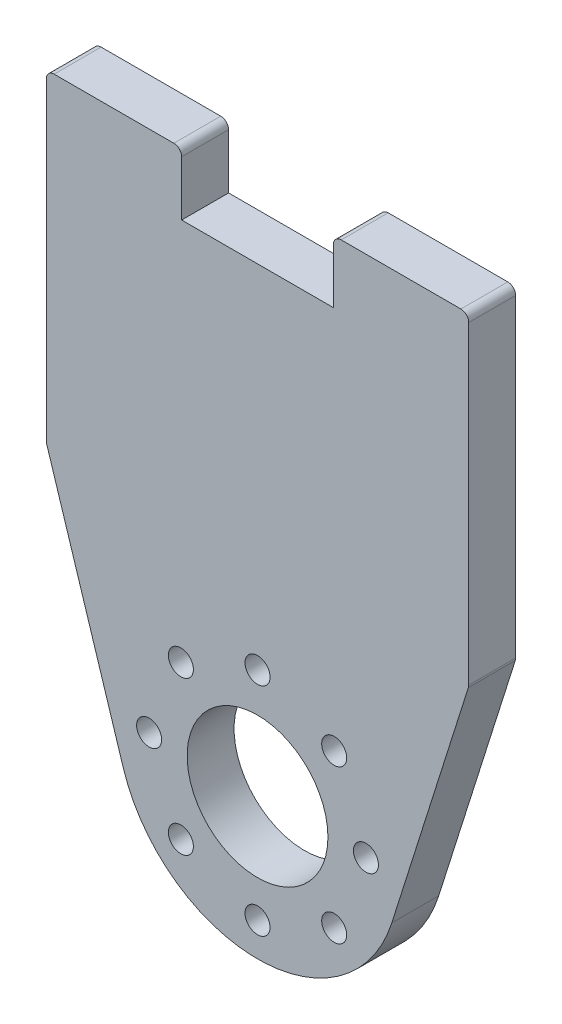
ISO-10303-21;
HEADER;
FILE_DESCRIPTION(('STEP AP214'),'2;1');
FILE_NAME('part.step','',(''),(''),'','','');
FILE_SCHEMA(('AUTOMOTIVE_DESIGN { 1 0 10303 214 1 1 1 1 }'));
ENDSEC;
DATA;
#1=APPLICATION_CONTEXT('core data for automotive mechanical design processes');
#2=APPLICATION_PROTOCOL_DEFINITION('international standard','automotive_design',2000,#1);
#3=PRODUCT_CONTEXT('',#1,'mechanical');
#4=PRODUCT('Part','Part','',(#3));
#5=PRODUCT_RELATED_PRODUCT_CATEGORY('part','',(#4));
#6=PRODUCT_DEFINITION_FORMATION('','',#4);
#7=PRODUCT_DEFINITION_CONTEXT('part definition',#1,'design');
#8=PRODUCT_DEFINITION('design','',#6,#7);
#9=PRODUCT_DEFINITION_SHAPE('','',#8);
#10=(LENGTH_UNIT() NAMED_UNIT(*) SI_UNIT(.MILLI.,.METRE.));
#11=(NAMED_UNIT(*) PLANE_ANGLE_UNIT() SI_UNIT($,.RADIAN.));
#12=(NAMED_UNIT(*) SI_UNIT($,.STERADIAN.) SOLID_ANGLE_UNIT());
#13=UNCERTAINTY_MEASURE_WITH_UNIT(LENGTH_MEASURE(1.E-05),#10,'distance_accuracy_value','');
#14=(GEOMETRIC_REPRESENTATION_CONTEXT(3) GLOBAL_UNCERTAINTY_ASSIGNED_CONTEXT((#13)) GLOBAL_UNIT_ASSIGNED_CONTEXT((#10,
#11,#12)) REPRESENTATION_CONTEXT('',''));
#15=CARTESIAN_POINT('',(0.,0.,0.));
#16=DIRECTION('',(0.,0.,1.));
#17=DIRECTION('',(1.,0.,0.));
#18=AXIS2_PLACEMENT_3D('',#15,#16,#17);
#19=CARTESIAN_POINT('',(0.,-29.4808369003028,3.));
#20=DIRECTION('',(0.,0.,-1.));
#21=DIRECTION('',(-1.,0.,0.));
#22=AXIS2_PLACEMENT_3D('',#19,#20,#21);
#23=CYLINDRICAL_SURFACE('',#22,9.);
#24=CARTESIAN_POINT('',(0.,-29.4808369003028,0.));
#25=DIRECTION('',(0.,0.,1.));
#26=DIRECTION('',(1.,0.,0.));
#27=AXIS2_PLACEMENT_3D('',#24,#25,#26);
#28=CIRCLE('',#27,9.);
#29=CARTESIAN_POINT('',(-8.5809139759614,-32.1952273175329,0.));
#30=VERTEX_POINT('',#29);
#31=CARTESIAN_POINT('',(8.5809139759614,-32.1952273175329,0.));
#32=VERTEX_POINT('',#31);
#33=EDGE_CURVE('E170',#30,#32,#28,.T.);
#34=ORIENTED_EDGE('',*,*,#33,.T.);
#35=DIRECTION('',(0.,0.,-1.));
#36=VECTOR('',#35,1.);
#37=CARTESIAN_POINT('',(8.5809139759614,-32.1952273175329,3.));
#38=LINE('',#37,#36);
#39=CARTESIAN_POINT('',(8.5809139759614,-32.1952273175329,3.));
#40=VERTEX_POINT('',#39);
#41=EDGE_CURVE('E152',#40,#32,#38,.T.);
#42=ORIENTED_EDGE('',*,*,#41,.F.);
#43=CARTESIAN_POINT('',(0.,-29.4808369003028,3.));
#44=DIRECTION('',(0.,0.,1.));
#45=DIRECTION('',(1.,0.,0.));
#46=AXIS2_PLACEMENT_3D('',#43,#44,#45);
#47=CIRCLE('',#46,9.);
#48=CARTESIAN_POINT('',(-8.5809139759614,-32.1952273175329,3.));
#49=VERTEX_POINT('',#48);
#50=EDGE_CURVE('E158',#49,#40,#47,.T.);
#51=ORIENTED_EDGE('',*,*,#50,.F.);
#52=DIRECTION('',(0.,0.,-1.));
#53=VECTOR('',#52,1.);
#54=CARTESIAN_POINT('',(-8.5809139759614,-32.1952273175329,3.));
#55=LINE('',#54,#53);
#56=EDGE_CURVE('E270',#49,#30,#55,.T.);
#57=ORIENTED_EDGE('',*,*,#56,.T.);
#58=EDGE_LOOP('',(#34,#42,#51,#57));
#59=FACE_BOUND('',#58,.T.);
#60=ADVANCED_FACE('F33',(#59),#23,.T.);
#61=CARTESIAN_POINT('',(17.0582744539399,-5.39602387833832,3.));
#62=DIRECTION('',(0.953434886217933,-0.301598935247784,0.));
#63=DIRECTION('',(0.301598935247784,0.953434886217933,0.));
#64=AXIS2_PLACEMENT_3D('',#61,#62,#63);
#65=PLANE('',#64);
#66=DIRECTION('',(-0.301598935247784,-0.953434886217933,0.));
#67=VECTOR('',#66,1.);
#68=CARTESIAN_POINT('',(17.0582744539399,-5.39602387833832,0.));
#69=LINE('',#68,#67);
#70=CARTESIAN_POINT('',(13.476717443109,-16.7182833495104,0.));
#71=VERTEX_POINT('',#70);
#72=EDGE_CURVE('E298',#71,#32,#69,.T.);
#73=ORIENTED_EDGE('',*,*,#72,.F.);
#74=DIRECTION('',(0.,0.,-1.));
#75=VECTOR('',#74,1.);
#76=CARTESIAN_POINT('',(13.476717443109,-16.7182833495104,3.));
#77=LINE('',#76,#75);
#78=CARTESIAN_POINT('',(13.476717443109,-16.7182833495104,3.));
#79=VERTEX_POINT('',#78);
#80=EDGE_CURVE('E155',#71,#79,#77,.F.);
#81=ORIENTED_EDGE('',*,*,#80,.T.);
#82=DIRECTION('',(-0.301598935247784,-0.953434886217933,0.));
#83=VECTOR('',#82,1.);
#84=CARTESIAN_POINT('',(17.0582744539399,-5.39602387833832,3.));
#85=LINE('',#84,#83);
#86=EDGE_CURVE('E147',#79,#40,#85,.T.);
#87=ORIENTED_EDGE('',*,*,#86,.T.);
#88=ORIENTED_EDGE('',*,*,#41,.T.);
#89=EDGE_LOOP('',(#73,#81,#87,#88));
#90=FACE_BOUND('',#89,.T.);
#91=ADVANCED_FACE('F150',(#90),#65,.T.);
#92=CARTESIAN_POINT('',(13.5,0.,3.));
#93=DIRECTION('',(1.,0.,0.));
#94=DIRECTION('',(0.,0.,-1.));
#95=AXIS2_PLACEMENT_3D('',#92,#93,#94);
#96=PLANE('',#95);
#97=DIRECTION('',(0.,-1.,0.));
#98=VECTOR('',#97,1.);
#99=CARTESIAN_POINT('',(13.5,0.,3.));
#100=LINE('',#99,#98);
#101=CARTESIAN_POINT('',(13.5,3.5,3.));
#102=VERTEX_POINT('',#101);
#103=CARTESIAN_POINT('',(13.5,-16.5674838818865,3.));
#104=VERTEX_POINT('',#103);
#105=EDGE_CURVE('E157',#102,#104,#100,.T.);
#106=ORIENTED_EDGE('',*,*,#105,.T.);
#107=DIRECTION('',(0.,0.,-1.));
#108=VECTOR('',#107,1.);
#109=CARTESIAN_POINT('',(13.5,-16.5674838818865,3.));
#110=LINE('',#109,#108);
#111=CARTESIAN_POINT('',(13.5,-16.5674838818865,0.));
#112=VERTEX_POINT('',#111);
#113=EDGE_CURVE('E174',#104,#112,#110,.T.);
#114=ORIENTED_EDGE('',*,*,#113,.T.);
#115=DIRECTION('',(0.,-1.,0.));
#116=VECTOR('',#115,1.);
#117=CARTESIAN_POINT('',(13.5,0.,0.));
#118=LINE('',#117,#116);
#119=CARTESIAN_POINT('',(13.5,3.5,0.));
#120=VERTEX_POINT('',#119);
#121=EDGE_CURVE('E296',#120,#112,#118,.T.);
#122=ORIENTED_EDGE('',*,*,#121,.F.);
#123=DIRECTION('',(0.,0.,-1.));
#124=VECTOR('',#123,1.);
#125=CARTESIAN_POINT('',(13.5,3.5,3.));
#126=LINE('',#125,#124);
#127=EDGE_CURVE('E171',#120,#102,#126,.F.);
#128=ORIENTED_EDGE('',*,*,#127,.T.);
#129=EDGE_LOOP('',(#106,#114,#122,#128));
#130=FACE_BOUND('',#129,.T.);
#131=ADVANCED_FACE('F366',(#130),#96,.T.);
#132=CARTESIAN_POINT('',(0.,4.,3.));
#133=DIRECTION('',(0.,1.,0.));
#134=DIRECTION('',(0.,0.,1.));
#135=AXIS2_PLACEMENT_3D('',#132,#133,#134);
#136=PLANE('',#135);
#137=DIRECTION('',(1.,0.,0.));
#138=VECTOR('',#137,1.);
#139=CARTESIAN_POINT('',(0.,4.,3.));
#140=LINE('',#139,#138);
#141=CARTESIAN_POINT('',(5.35,4.,3.));
#142=VERTEX_POINT('',#141);
#143=CARTESIAN_POINT('',(13.,4.,3.));
#144=VERTEX_POINT('',#143);
#145=EDGE_CURVE('E338',#142,#144,#140,.T.);
#146=ORIENTED_EDGE('',*,*,#145,.T.);
#147=DIRECTION('',(0.,0.,-1.));
#148=VECTOR('',#147,1.);
#149=CARTESIAN_POINT('',(13.,4.,3.));
#150=LINE('',#149,#148);
#151=CARTESIAN_POINT('',(13.,4.,0.));
#152=VERTEX_POINT('',#151);
#153=EDGE_CURVE('E207',#144,#152,#150,.T.);
#154=ORIENTED_EDGE('',*,*,#153,.T.);
#155=DIRECTION('',(1.,0.,0.));
#156=VECTOR('',#155,1.);
#157=CARTESIAN_POINT('',(0.,4.,0.));
#158=LINE('',#157,#156);
#159=CARTESIAN_POINT('',(5.35,4.,0.));
#160=VERTEX_POINT('',#159);
#161=EDGE_CURVE('E291',#160,#152,#158,.T.);
#162=ORIENTED_EDGE('',*,*,#161,.F.);
#163=DIRECTION('',(0.,0.,-1.));
#164=VECTOR('',#163,1.);
#165=CARTESIAN_POINT('',(5.35,4.,3.));
#166=LINE('',#165,#164);
#167=EDGE_CURVE('E205',#160,#142,#166,.F.);
#168=ORIENTED_EDGE('',*,*,#167,.T.);
#169=EDGE_LOOP('',(#146,#154,#162,#168));
#170=FACE_BOUND('',#169,.T.);
#171=ADVANCED_FACE('F407',(#170),#136,.T.);
#172=CARTESIAN_POINT('',(4.85,0.,3.));
#173=DIRECTION('',(-1.,0.,0.));
#174=DIRECTION('',(0.,-1.,0.));
#175=AXIS2_PLACEMENT_3D('',#172,#173,#174);
#176=PLANE('',#175);
#177=DIRECTION('',(0.,1.,0.));
#178=VECTOR('',#177,1.);
#179=CARTESIAN_POINT('',(4.85,0.,3.));
#180=LINE('',#179,#178);
#181=CARTESIAN_POINT('',(4.85,0.,3.));
#182=VERTEX_POINT('',#181);
#183=CARTESIAN_POINT('',(4.85,3.5,3.));
#184=VERTEX_POINT('',#183);
#185=EDGE_CURVE('E335',#182,#184,#180,.T.);
#186=ORIENTED_EDGE('',*,*,#185,.T.);
#187=DIRECTION('',(0.,0.,-1.));
#188=VECTOR('',#187,1.);
#189=CARTESIAN_POINT('',(4.85,3.5,3.));
#190=LINE('',#189,#188);
#191=CARTESIAN_POINT('',(4.85,3.5,0.));
#192=VERTEX_POINT('',#191);
#193=EDGE_CURVE('E210',#184,#192,#190,.T.);
#194=ORIENTED_EDGE('',*,*,#193,.T.);
#195=DIRECTION('',(0.,1.,0.));
#196=VECTOR('',#195,1.);
#197=CARTESIAN_POINT('',(4.85,0.,0.));
#198=LINE('',#197,#196);
#199=CARTESIAN_POINT('',(4.85,0.,0.));
#200=VERTEX_POINT('',#199);
#201=EDGE_CURVE('E289',#200,#192,#198,.T.);
#202=ORIENTED_EDGE('',*,*,#201,.F.);
#203=DIRECTION('',(0.,0.,-1.));
#204=VECTOR('',#203,1.);
#205=CARTESIAN_POINT('',(4.85,0.,3.));
#206=LINE('',#205,#204);
#207=EDGE_CURVE('E172',#182,#200,#206,.T.);
#208=ORIENTED_EDGE('',*,*,#207,.F.);
#209=EDGE_LOOP('',(#186,#194,#202,#208));
#210=FACE_BOUND('',#209,.T.);
#211=ADVANCED_FACE('F403',(#210),#176,.T.);
#212=CARTESIAN_POINT('',(0.,0.,3.));
#213=DIRECTION('',(0.,1.,0.));
#214=DIRECTION('',(-1.,0.,0.));
#215=AXIS2_PLACEMENT_3D('',#212,#213,#214);
#216=PLANE('',#215);
#217=DIRECTION('',(1.,0.,0.));
#218=VECTOR('',#217,1.);
#219=CARTESIAN_POINT('',(0.,0.,0.));
#220=LINE('',#219,#218);
#221=CARTESIAN_POINT('',(-4.85,0.,0.));
#222=VERTEX_POINT('',#221);
#223=EDGE_CURVE('E285',#222,#200,#220,.T.);
#224=ORIENTED_EDGE('',*,*,#223,.F.);
#225=DIRECTION('',(0.,0.,-1.));
#226=VECTOR('',#225,1.);
#227=CARTESIAN_POINT('',(-4.85,0.,3.));
#228=LINE('',#227,#226);
#229=CARTESIAN_POINT('',(-4.85,0.,3.));
#230=VERTEX_POINT('',#229);
#231=EDGE_CURVE('E176',#230,#222,#228,.T.);
#232=ORIENTED_EDGE('',*,*,#231,.F.);
#233=DIRECTION('',(1.,0.,0.));
#234=VECTOR('',#233,1.);
#235=CARTESIAN_POINT('',(0.,0.,3.));
#236=LINE('',#235,#234);
#237=EDGE_CURVE('E333',#230,#182,#236,.T.);
#238=ORIENTED_EDGE('',*,*,#237,.T.);
#239=ORIENTED_EDGE('',*,*,#207,.T.);
#240=EDGE_LOOP('',(#224,#232,#238,#239));
#241=FACE_BOUND('',#240,.T.);
#242=ADVANCED_FACE('F286',(#241),#216,.T.);
#243=CARTESIAN_POINT('',(-4.85,0.,3.));
#244=DIRECTION('',(1.,0.,0.));
#245=DIRECTION('',(0.,0.,-1.));
#246=AXIS2_PLACEMENT_3D('',#243,#244,#245);
#247=PLANE('',#246);
#248=DIRECTION('',(0.,-1.,0.));
#249=VECTOR('',#248,1.);
#250=CARTESIAN_POINT('',(-4.85,0.,0.));
#251=LINE('',#250,#249);
#252=CARTESIAN_POINT('',(-4.85,3.5,0.));
#253=VERTEX_POINT('',#252);
#254=EDGE_CURVE('E243',#253,#222,#251,.T.);
#255=ORIENTED_EDGE('',*,*,#254,.F.);
#256=DIRECTION('',(0.,0.,-1.));
#257=VECTOR('',#256,1.);
#258=CARTESIAN_POINT('',(-4.85,3.5,3.));
#259=LINE('',#258,#257);
#260=CARTESIAN_POINT('',(-4.85,3.5,3.));
#261=VERTEX_POINT('',#260);
#262=EDGE_CURVE('E218',#253,#261,#259,.F.);
#263=ORIENTED_EDGE('',*,*,#262,.T.);
#264=DIRECTION('',(0.,-1.,0.));
#265=VECTOR('',#264,1.);
#266=CARTESIAN_POINT('',(-4.85,0.,3.));
#267=LINE('',#266,#265);
#268=EDGE_CURVE('E280',#261,#230,#267,.T.);
#269=ORIENTED_EDGE('',*,*,#268,.T.);
#270=ORIENTED_EDGE('',*,*,#231,.T.);
#271=EDGE_LOOP('',(#255,#263,#269,#270));
#272=FACE_BOUND('',#271,.T.);
#273=ADVANCED_FACE('F277',(#272),#247,.T.);
#274=CARTESIAN_POINT('',(0.,4.,3.));
#275=DIRECTION('',(0.,1.,0.));
#276=DIRECTION('',(0.,0.,1.));
#277=AXIS2_PLACEMENT_3D('',#274,#275,#276);
#278=PLANE('',#277);
#279=DIRECTION('',(1.,0.,0.));
#280=VECTOR('',#279,1.);
#281=CARTESIAN_POINT('',(0.,4.,3.));
#282=LINE('',#281,#280);
#283=CARTESIAN_POINT('',(-13.,4.,3.));
#284=VERTEX_POINT('',#283);
#285=CARTESIAN_POINT('',(-5.35,4.,3.));
#286=VERTEX_POINT('',#285);
#287=EDGE_CURVE('E329',#284,#286,#282,.T.);
#288=ORIENTED_EDGE('',*,*,#287,.T.);
#289=DIRECTION('',(0.,0.,-1.));
#290=VECTOR('',#289,1.);
#291=CARTESIAN_POINT('',(-5.35,4.,3.));
#292=LINE('',#291,#290);
#293=CARTESIAN_POINT('',(-5.35,4.,0.));
#294=VERTEX_POINT('',#293);
#295=EDGE_CURVE('E215',#286,#294,#292,.T.);
#296=ORIENTED_EDGE('',*,*,#295,.T.);
#297=DIRECTION('',(1.,0.,0.));
#298=VECTOR('',#297,1.);
#299=CARTESIAN_POINT('',(0.,4.,0.));
#300=LINE('',#299,#298);
#301=CARTESIAN_POINT('',(-13.,4.,0.));
#302=VERTEX_POINT('',#301);
#303=EDGE_CURVE('E239',#302,#294,#300,.T.);
#304=ORIENTED_EDGE('',*,*,#303,.F.);
#305=DIRECTION('',(0.,0.,-1.));
#306=VECTOR('',#305,1.);
#307=CARTESIAN_POINT('',(-13.,4.,3.));
#308=LINE('',#307,#306);
#309=EDGE_CURVE('E213',#302,#284,#308,.F.);
#310=ORIENTED_EDGE('',*,*,#309,.T.);
#311=EDGE_LOOP('',(#288,#296,#304,#310));
#312=FACE_BOUND('',#311,.T.);
#313=ADVANCED_FACE('F395',(#312),#278,.T.);
#314=CARTESIAN_POINT('',(-13.5,0.,3.));
#315=DIRECTION('',(-1.,0.,0.));
#316=DIRECTION('',(0.,0.,1.));
#317=AXIS2_PLACEMENT_3D('',#314,#315,#316);
#318=PLANE('',#317);
#319=DIRECTION('',(0.,1.,0.));
#320=VECTOR('',#319,1.);
#321=CARTESIAN_POINT('',(-13.5,0.,3.));
#322=LINE('',#321,#320);
#323=CARTESIAN_POINT('',(-13.5,-16.5674838818865,3.));
#324=VERTEX_POINT('',#323);
#325=CARTESIAN_POINT('',(-13.5,3.5,3.));
#326=VERTEX_POINT('',#325);
#327=EDGE_CURVE('E229',#324,#326,#322,.T.);
#328=ORIENTED_EDGE('',*,*,#327,.T.);
#329=DIRECTION('',(0.,0.,-1.));
#330=VECTOR('',#329,1.);
#331=CARTESIAN_POINT('',(-13.5,3.5,3.));
#332=LINE('',#331,#330);
#333=CARTESIAN_POINT('',(-13.5,3.5,0.));
#334=VERTEX_POINT('',#333);
#335=EDGE_CURVE('E41',#326,#334,#332,.T.);
#336=ORIENTED_EDGE('',*,*,#335,.T.);
#337=DIRECTION('',(0.,1.,0.));
#338=VECTOR('',#337,1.);
#339=CARTESIAN_POINT('',(-13.5,0.,0.));
#340=LINE('',#339,#338);
#341=CARTESIAN_POINT('',(-13.5,-16.5674838818865,0.));
#342=VERTEX_POINT('',#341);
#343=EDGE_CURVE('E227',#342,#334,#340,.T.);
#344=ORIENTED_EDGE('',*,*,#343,.F.);
#345=DIRECTION('',(0.,0.,-1.));
#346=VECTOR('',#345,1.);
#347=CARTESIAN_POINT('',(-13.5,-16.5674838818865,3.));
#348=LINE('',#347,#346);
#349=EDGE_CURVE('E220',#342,#324,#348,.F.);
#350=ORIENTED_EDGE('',*,*,#349,.T.);
#351=EDGE_LOOP('',(#328,#336,#344,#350));
#352=FACE_BOUND('',#351,.T.);
#353=ADVANCED_FACE('F226',(#352),#318,.T.);
#354=CARTESIAN_POINT('',(6.92938229027665,-29.4102191905791,3.));
#355=DIRECTION('',(0.,0.,-1.));
#356=DIRECTION('',(-1.,0.,0.));
#357=AXIS2_PLACEMENT_3D('',#354,#355,#356);
#358=CYLINDRICAL_SURFACE('',#357,0.799999999999997);
#359=CARTESIAN_POINT('',(6.92938229027665,-29.4102191905791,3.));
#360=DIRECTION('',(0.,0.,1.));
#361=DIRECTION('',(1.,0.,0.));
#362=AXIS2_PLACEMENT_3D('',#359,#360,#361);
#363=CIRCLE('',#362,0.799999999999997);
#364=CARTESIAN_POINT('',(7.72938229027665,-29.4102191905791,3.));
#365=VERTEX_POINT('',#364);
#366=EDGE_CURVE('E306',#365,#365,#363,.T.);
#367=ORIENTED_EDGE('',*,*,#366,.T.);
#368=EDGE_LOOP('',(#367));
#369=FACE_BOUND('',#368,.T.);
#370=CARTESIAN_POINT('',(6.92938229027665,-29.4102191905791,0.));
#371=DIRECTION('',(0.,0.,1.));
#372=DIRECTION('',(1.,0.,0.));
#373=AXIS2_PLACEMENT_3D('',#370,#371,#372);
#374=CIRCLE('',#373,0.799999999999997);
#375=CARTESIAN_POINT('',(7.72938229027665,-29.4102191905791,0.));
#376=VERTEX_POINT('',#375);
#377=EDGE_CURVE('E264',#376,#376,#374,.T.);
#378=ORIENTED_EDGE('',*,*,#377,.F.);
#379=EDGE_LOOP('',(#378));
#380=FACE_BOUND('',#379,.T.);
#381=ADVANCED_FACE('F430',(#369,#380),#358,.F.);
#382=CARTESIAN_POINT('',(4.89981320688851,-24.5104059836907,3.));
#383=DIRECTION('',(0.,0.,-1.));
#384=DIRECTION('',(-1.,0.,0.));
#385=AXIS2_PLACEMENT_3D('',#382,#383,#384);
#386=CYLINDRICAL_SURFACE('',#385,0.799999999999999);
#387=CARTESIAN_POINT('',(4.89981320688851,-24.5104059836907,3.));
#388=DIRECTION('',(0.,0.,1.));
#389=DIRECTION('',(1.,0.,0.));
#390=AXIS2_PLACEMENT_3D('',#387,#388,#389);
#391=CIRCLE('',#390,0.799999999999999);
#392=CARTESIAN_POINT('',(5.69981320688851,-24.5104059836907,3.));
#393=VERTEX_POINT('',#392);
#394=EDGE_CURVE('E309',#393,#393,#391,.T.);
#395=ORIENTED_EDGE('',*,*,#394,.T.);
#396=EDGE_LOOP('',(#395));
#397=FACE_BOUND('',#396,.T.);
#398=CARTESIAN_POINT('',(4.89981320688851,-24.5104059836907,0.));
#399=DIRECTION('',(0.,0.,1.));
#400=DIRECTION('',(1.,0.,0.));
#401=AXIS2_PLACEMENT_3D('',#398,#399,#400);
#402=CIRCLE('',#401,0.799999999999999);
#403=CARTESIAN_POINT('',(5.69981320688851,-24.5104059836907,0.));
#404=VERTEX_POINT('',#403);
#405=EDGE_CURVE('E261',#404,#404,#402,.T.);
#406=ORIENTED_EDGE('',*,*,#405,.F.);
#407=EDGE_LOOP('',(#406));
#408=FACE_BOUND('',#407,.T.);
#409=ADVANCED_FACE('F475',(#397,#408),#386,.F.);
#410=CARTESIAN_POINT('',(-4.89981320688812,-34.3100323974679,3.));
#411=DIRECTION('',(0.,0.,-1.));
#412=DIRECTION('',(-1.,0.,0.));
#413=AXIS2_PLACEMENT_3D('',#410,#411,#412);
#414=CYLINDRICAL_SURFACE('',#413,0.800000000000005);
#415=CARTESIAN_POINT('',(-4.89981320688812,-34.3100323974679,3.));
#416=DIRECTION('',(0.,0.,1.));
#417=DIRECTION('',(1.,0.,0.));
#418=AXIS2_PLACEMENT_3D('',#415,#416,#417);
#419=CIRCLE('',#418,0.800000000000005);
#420=CARTESIAN_POINT('',(-4.09981320688812,-34.3100323974679,3.));
#421=VERTEX_POINT('',#420);
#422=EDGE_CURVE('E312',#421,#421,#419,.T.);
#423=ORIENTED_EDGE('',*,*,#422,.T.);
#424=EDGE_LOOP('',(#423));
#425=FACE_BOUND('',#424,.T.);
#426=CARTESIAN_POINT('',(-4.89981320688812,-34.3100323974679,0.));
#427=DIRECTION('',(0.,0.,1.));
#428=DIRECTION('',(1.,0.,0.));
#429=AXIS2_PLACEMENT_3D('',#426,#427,#428);
#430=CIRCLE('',#429,0.800000000000005);
#431=CARTESIAN_POINT('',(-4.09981320688812,-34.3100323974679,0.));
#432=VERTEX_POINT('',#431);
#433=EDGE_CURVE('E258',#432,#432,#430,.T.);
#434=ORIENTED_EDGE('',*,*,#433,.F.);
#435=EDGE_LOOP('',(#434));
#436=FACE_BOUND('',#435,.T.);
#437=ADVANCED_FACE('F483',(#425,#436),#414,.F.);
#438=CARTESIAN_POINT('',(-6.92938229027627,-29.4102191905795,3.));
#439=DIRECTION('',(0.,0.,-1.));
#440=DIRECTION('',(-1.,0.,0.));
#441=AXIS2_PLACEMENT_3D('',#438,#439,#440);
#442=CYLINDRICAL_SURFACE('',#441,0.8);
#443=CARTESIAN_POINT('',(-6.92938229027627,-29.4102191905795,3.));
#444=DIRECTION('',(0.,0.,1.));
#445=DIRECTION('',(1.,0.,0.));
#446=AXIS2_PLACEMENT_3D('',#443,#444,#445);
#447=CIRCLE('',#446,0.8);
#448=CARTESIAN_POINT('',(-6.12938229027627,-29.4102191905795,3.));
#449=VERTEX_POINT('',#448);
#450=EDGE_CURVE('E315',#449,#449,#447,.T.);
#451=ORIENTED_EDGE('',*,*,#450,.T.);
#452=EDGE_LOOP('',(#451));
#453=FACE_BOUND('',#452,.T.);
#454=CARTESIAN_POINT('',(-6.92938229027627,-29.4102191905795,0.));
#455=DIRECTION('',(0.,0.,1.));
#456=DIRECTION('',(1.,0.,0.));
#457=AXIS2_PLACEMENT_3D('',#454,#455,#456);
#458=CIRCLE('',#457,0.8);
#459=CARTESIAN_POINT('',(-6.12938229027627,-29.4102191905795,0.));
#460=VERTEX_POINT('',#459);
#461=EDGE_CURVE('E255',#460,#460,#458,.T.);
#462=ORIENTED_EDGE('',*,*,#461,.F.);
#463=EDGE_LOOP('',(#462));
#464=FACE_BOUND('',#463,.T.);
#465=ADVANCED_FACE('F491',(#453,#464),#442,.F.);
#466=CARTESIAN_POINT('',(-4.8998132068884,-24.510405983691,3.));
#467=DIRECTION('',(0.,0.,-1.));
#468=DIRECTION('',(-1.,0.,0.));
#469=AXIS2_PLACEMENT_3D('',#466,#467,#468);
#470=CYLINDRICAL_SURFACE('',#469,0.799999999999997);
#471=CARTESIAN_POINT('',(-4.8998132068884,-24.510405983691,3.));
#472=DIRECTION('',(0.,0.,1.));
#473=DIRECTION('',(1.,0.,0.));
#474=AXIS2_PLACEMENT_3D('',#471,#472,#473);
#475=CIRCLE('',#474,0.799999999999997);
#476=CARTESIAN_POINT('',(-4.0998132068884,-24.510405983691,3.));
#477=VERTEX_POINT('',#476);
#478=EDGE_CURVE('E318',#477,#477,#475,.T.);
#479=ORIENTED_EDGE('',*,*,#478,.T.);
#480=EDGE_LOOP('',(#479));
#481=FACE_BOUND('',#480,.T.);
#482=CARTESIAN_POINT('',(-4.8998132068884,-24.510405983691,0.));
#483=DIRECTION('',(0.,0.,1.));
#484=DIRECTION('',(1.,0.,0.));
#485=AXIS2_PLACEMENT_3D('',#482,#483,#484);
#486=CIRCLE('',#485,0.799999999999997);
#487=CARTESIAN_POINT('',(-4.0998132068884,-24.510405983691,0.));
#488=VERTEX_POINT('',#487);
#489=EDGE_CURVE('E252',#488,#488,#486,.T.);
#490=ORIENTED_EDGE('',*,*,#489,.F.);
#491=EDGE_LOOP('',(#490));
#492=FACE_BOUND('',#491,.T.);
#493=ADVANCED_FACE('F499',(#481,#492),#470,.F.);
#494=CARTESIAN_POINT('',(0.,-29.4808369003028,3.));
#495=DIRECTION('',(0.,0.,-1.));
#496=DIRECTION('',(-1.,0.,0.));
#497=AXIS2_PLACEMENT_3D('',#494,#495,#496);
#498=CYLINDRICAL_SURFACE('',#497,4.5);
#499=CARTESIAN_POINT('',(0.,-29.4808369003028,3.));
#500=DIRECTION('',(0.,0.,1.));
#501=DIRECTION('',(1.,0.,0.));
#502=AXIS2_PLACEMENT_3D('',#499,#500,#501);
#503=CIRCLE('',#502,4.5);
#504=CARTESIAN_POINT('',(4.5,-29.4808369003028,3.));
#505=VERTEX_POINT('',#504);
#506=EDGE_CURVE('E321',#505,#505,#503,.T.);
#507=ORIENTED_EDGE('',*,*,#506,.T.);
#508=EDGE_LOOP('',(#507));
#509=FACE_BOUND('',#508,.T.);
#510=CARTESIAN_POINT('',(0.,-29.4808369003028,0.));
#511=DIRECTION('',(0.,0.,1.));
#512=DIRECTION('',(1.,0.,0.));
#513=AXIS2_PLACEMENT_3D('',#510,#511,#512);
#514=CIRCLE('',#513,4.5);
#515=CARTESIAN_POINT('',(4.5,-29.4808369003028,0.));
#516=VERTEX_POINT('',#515);
#517=EDGE_CURVE('E249',#516,#516,#514,.T.);
#518=ORIENTED_EDGE('',*,*,#517,.F.);
#519=EDGE_LOOP('',(#518));
#520=FACE_BOUND('',#519,.T.);
#521=ADVANCED_FACE('F423',(#509,#520),#498,.F.);
#522=CARTESIAN_POINT('',(3.9058927972018E-13,-36.3396014808557,3.));
#523=DIRECTION('',(0.,0.,-1.));
#524=DIRECTION('',(-1.,0.,0.));
#525=AXIS2_PLACEMENT_3D('',#522,#523,#524);
#526=CYLINDRICAL_SURFACE('',#525,0.800000000000006);
#527=CARTESIAN_POINT('',(3.9058927972018E-13,-36.3396014808557,3.));
#528=DIRECTION('',(0.,0.,1.));
#529=DIRECTION('',(1.,0.,0.));
#530=AXIS2_PLACEMENT_3D('',#527,#528,#529);
#531=CIRCLE('',#530,0.800000000000006);
#532=CARTESIAN_POINT('',(0.800000000000396,-36.3396014808557,3.));
#533=VERTEX_POINT('',#532);
#534=EDGE_CURVE('E324',#533,#533,#531,.T.);
#535=ORIENTED_EDGE('',*,*,#534,.T.);
#536=EDGE_LOOP('',(#535));
#537=FACE_BOUND('',#536,.T.);
#538=CARTESIAN_POINT('',(3.9058927972018E-13,-36.3396014808557,0.));
#539=DIRECTION('',(0.,0.,1.));
#540=DIRECTION('',(1.,0.,0.));
#541=AXIS2_PLACEMENT_3D('',#538,#539,#540);
#542=CIRCLE('',#541,0.800000000000006);
#543=CARTESIAN_POINT('',(0.800000000000396,-36.3396014808557,0.));
#544=VERTEX_POINT('',#543);
#545=EDGE_CURVE('E241',#544,#544,#542,.T.);
#546=ORIENTED_EDGE('',*,*,#545,.F.);
#547=EDGE_LOOP('',(#546));
#548=FACE_BOUND('',#547,.T.);
#549=ADVANCED_FACE('F418',(#537,#548),#526,.F.);
#550=CARTESIAN_POINT('',(-17.0582744539399,-5.39602387833833,3.));
#551=DIRECTION('',(0.953434886217933,0.301598935247784,0.));
#552=DIRECTION('',(-0.301598935247784,0.953434886217933,0.));
#553=AXIS2_PLACEMENT_3D('',#550,#551,#552);
#554=PLANE('',#553);
#555=DIRECTION('',(0.301598935247784,-0.953434886217933,0.));
#556=VECTOR('',#555,1.);
#557=CARTESIAN_POINT('',(-17.0582744539399,-5.39602387833833,3.));
#558=LINE('',#557,#556);
#559=CARTESIAN_POINT('',(-13.476717443109,-16.7182833495104,3.));
#560=VERTEX_POINT('',#559);
#561=EDGE_CURVE('E163',#560,#49,#558,.T.);
#562=ORIENTED_EDGE('',*,*,#561,.F.);
#563=DIRECTION('',(0.,0.,-1.));
#564=VECTOR('',#563,1.);
#565=CARTESIAN_POINT('',(-13.476717443109,-16.7182833495104,0.));
#566=LINE('',#565,#564);
#567=CARTESIAN_POINT('',(-13.476717443109,-16.7182833495104,0.));
#568=VERTEX_POINT('',#567);
#569=EDGE_CURVE('E11',#560,#568,#566,.T.);
#570=ORIENTED_EDGE('',*,*,#569,.T.);
#571=DIRECTION('',(0.301598935247784,-0.953434886217933,0.));
#572=VECTOR('',#571,1.);
#573=CARTESIAN_POINT('',(-17.0582744539399,-5.39602387833833,0.));
#574=LINE('',#573,#572);
#575=EDGE_CURVE('E238',#568,#30,#574,.T.);
#576=ORIENTED_EDGE('',*,*,#575,.T.);
#577=ORIENTED_EDGE('',*,*,#56,.F.);
#578=EDGE_LOOP('',(#562,#570,#576,#577));
#579=FACE_BOUND('',#578,.T.);
#580=ADVANCED_FACE('F372',(#579),#554,.F.);
#581=CARTESIAN_POINT('',(0.,-22.4808369003028,3.));
#582=DIRECTION('',(0.,0.,-1.));
#583=DIRECTION('',(-1.,0.,0.));
#584=AXIS2_PLACEMENT_3D('',#581,#582,#583);
#585=CYLINDRICAL_SURFACE('',#584,0.799999999999996);
#586=CARTESIAN_POINT('',(0.,-22.4808369003028,3.));
#587=DIRECTION('',(0.,0.,1.));
#588=DIRECTION('',(1.,0.,0.));
#589=AXIS2_PLACEMENT_3D('',#586,#587,#588);
#590=CIRCLE('',#589,0.799999999999996);
#591=CARTESIAN_POINT('',(0.799999999999996,-22.4808369003028,3.));
#592=VERTEX_POINT('',#591);
#593=EDGE_CURVE('E167',#592,#592,#590,.T.);
#594=ORIENTED_EDGE('',*,*,#593,.T.);
#595=EDGE_LOOP('',(#594));
#596=FACE_BOUND('',#595,.T.);
#597=CARTESIAN_POINT('',(0.,-22.4808369003028,0.));
#598=DIRECTION('',(0.,0.,1.));
#599=DIRECTION('',(1.,0.,0.));
#600=AXIS2_PLACEMENT_3D('',#597,#598,#599);
#601=CIRCLE('',#600,0.799999999999996);
#602=CARTESIAN_POINT('',(0.799999999999996,-22.4808369003028,0.));
#603=VERTEX_POINT('',#602);
#604=EDGE_CURVE('E301',#603,#603,#601,.T.);
#605=ORIENTED_EDGE('',*,*,#604,.F.);
#606=EDGE_LOOP('',(#605));
#607=FACE_BOUND('',#606,.T.);
#608=ADVANCED_FACE('F346',(#596,#607),#585,.F.);
#609=CARTESIAN_POINT('',(4.89981320688879,-34.3100323974676,3.));
#610=DIRECTION('',(0.,0.,-1.));
#611=DIRECTION('',(-1.,0.,0.));
#612=AXIS2_PLACEMENT_3D('',#609,#610,#611);
#613=CYLINDRICAL_SURFACE('',#612,0.800000000000006);
#614=CARTESIAN_POINT('',(4.89981320688879,-34.3100323974676,3.));
#615=DIRECTION('',(0.,0.,1.));
#616=DIRECTION('',(1.,0.,0.));
#617=AXIS2_PLACEMENT_3D('',#614,#615,#616);
#618=CIRCLE('',#617,0.800000000000006);
#619=CARTESIAN_POINT('',(5.69981320688879,-34.3100323974676,3.));
#620=VERTEX_POINT('',#619);
#621=EDGE_CURVE('E271',#620,#620,#618,.T.);
#622=ORIENTED_EDGE('',*,*,#621,.T.);
#623=EDGE_LOOP('',(#622));
#624=FACE_BOUND('',#623,.T.);
#625=CARTESIAN_POINT('',(4.89981320688879,-34.3100323974676,0.));
#626=DIRECTION('',(0.,0.,1.));
#627=DIRECTION('',(1.,0.,0.));
#628=AXIS2_PLACEMENT_3D('',#625,#626,#627);
#629=CIRCLE('',#628,0.800000000000006);
#630=CARTESIAN_POINT('',(5.69981320688879,-34.3100323974676,0.));
#631=VERTEX_POINT('',#630);
#632=EDGE_CURVE('E267',#631,#631,#629,.T.);
#633=ORIENTED_EDGE('',*,*,#632,.F.);
#634=EDGE_LOOP('',(#633));
#635=FACE_BOUND('',#634,.T.);
#636=ADVANCED_FACE('F350',(#624,#635),#613,.F.);
#637=CARTESIAN_POINT('',(0.,0.,3.));
#638=DIRECTION('',(0.,0.,1.));
#639=DIRECTION('',(1.,0.,0.));
#640=AXIS2_PLACEMENT_3D('',#637,#638,#639);
#641=PLANE('',#640);
#642=ORIENTED_EDGE('',*,*,#593,.F.);
#643=EDGE_LOOP('',(#642));
#644=FACE_BOUND('',#643,.T.);
#645=ORIENTED_EDGE('',*,*,#86,.F.);
#646=CARTESIAN_POINT('',(13.,-16.5674838818865,3.));
#647=DIRECTION('',(0.,0.,1.));
#648=DIRECTION('',(1.,0.,0.));
#649=AXIS2_PLACEMENT_3D('',#646,#647,#648);
#650=CIRCLE('',#649,0.5);
#651=EDGE_CURVE('E203',#79,#104,#650,.T.);
#652=ORIENTED_EDGE('',*,*,#651,.T.);
#653=ORIENTED_EDGE('',*,*,#105,.F.);
#654=CARTESIAN_POINT('',(13.,3.5,3.));
#655=DIRECTION('',(0.,0.,1.));
#656=DIRECTION('',(1.,0.,0.));
#657=AXIS2_PLACEMENT_3D('',#654,#655,#656);
#658=CIRCLE('',#657,0.5);
#659=EDGE_CURVE('E201',#102,#144,#658,.T.);
#660=ORIENTED_EDGE('',*,*,#659,.T.);
#661=ORIENTED_EDGE('',*,*,#145,.F.);
#662=CARTESIAN_POINT('',(5.35,3.5,3.));
#663=DIRECTION('',(0.,0.,1.));
#664=DIRECTION('',(1.,0.,0.));
#665=AXIS2_PLACEMENT_3D('',#662,#663,#664);
#666=CIRCLE('',#665,0.5);
#667=EDGE_CURVE('E199',#142,#184,#666,.T.);
#668=ORIENTED_EDGE('',*,*,#667,.T.);
#669=ORIENTED_EDGE('',*,*,#185,.F.);
#670=ORIENTED_EDGE('',*,*,#237,.F.);
#671=ORIENTED_EDGE('',*,*,#268,.F.);
#672=CARTESIAN_POINT('',(-5.35,3.5,3.));
#673=DIRECTION('',(0.,0.,1.));
#674=DIRECTION('',(1.,0.,0.));
#675=AXIS2_PLACEMENT_3D('',#672,#673,#674);
#676=CIRCLE('',#675,0.5);
#677=EDGE_CURVE('E197',#261,#286,#676,.T.);
#678=ORIENTED_EDGE('',*,*,#677,.T.);
#679=ORIENTED_EDGE('',*,*,#287,.F.);
#680=CARTESIAN_POINT('',(-13.,3.5,3.));
#681=DIRECTION('',(0.,0.,1.));
#682=DIRECTION('',(1.,0.,0.));
#683=AXIS2_PLACEMENT_3D('',#680,#681,#682);
#684=CIRCLE('',#683,0.5);
#685=EDGE_CURVE('E54',#284,#326,#684,.T.);
#686=ORIENTED_EDGE('',*,*,#685,.T.);
#687=ORIENTED_EDGE('',*,*,#327,.F.);
#688=CARTESIAN_POINT('',(-13.,-16.5674838818865,3.));
#689=DIRECTION('',(0.,0.,1.));
#690=DIRECTION('',(1.,0.,0.));
#691=AXIS2_PLACEMENT_3D('',#688,#689,#690);
#692=CIRCLE('',#691,0.5);
#693=EDGE_CURVE('E48',#324,#560,#692,.T.);
#694=ORIENTED_EDGE('',*,*,#693,.T.);
#695=ORIENTED_EDGE('',*,*,#561,.T.);
#696=ORIENTED_EDGE('',*,*,#50,.T.);
#697=EDGE_LOOP('',(#645,#652,#653,#660,#661,#668,#669,#670,#671,#678,#679,#686,#687,#694,#695,#696));
#698=FACE_BOUND('',#697,.T.);
#699=ORIENTED_EDGE('',*,*,#534,.F.);
#700=EDGE_LOOP('',(#699));
#701=FACE_BOUND('',#700,.T.);
#702=ORIENTED_EDGE('',*,*,#506,.F.);
#703=EDGE_LOOP('',(#702));
#704=FACE_BOUND('',#703,.T.);
#705=ORIENTED_EDGE('',*,*,#478,.F.);
#706=EDGE_LOOP('',(#705));
#707=FACE_BOUND('',#706,.T.);
#708=ORIENTED_EDGE('',*,*,#450,.F.);
#709=EDGE_LOOP('',(#708));
#710=FACE_BOUND('',#709,.T.);
#711=ORIENTED_EDGE('',*,*,#422,.F.);
#712=EDGE_LOOP('',(#711));
#713=FACE_BOUND('',#712,.T.);
#714=ORIENTED_EDGE('',*,*,#394,.F.);
#715=EDGE_LOOP('',(#714));
#716=FACE_BOUND('',#715,.T.);
#717=ORIENTED_EDGE('',*,*,#366,.F.);
#718=EDGE_LOOP('',(#717));
#719=FACE_BOUND('',#718,.T.);
#720=ORIENTED_EDGE('',*,*,#621,.F.);
#721=EDGE_LOOP('',(#720));
#722=FACE_BOUND('',#721,.T.);
#723=ADVANCED_FACE('F161',(#644,#698,#701,#704,#707,#710,#713,#716,#719,#722),#641,.T.);
#724=CARTESIAN_POINT('',(0.,0.,0.));
#725=DIRECTION('',(0.,0.,1.));
#726=DIRECTION('',(1.,0.,0.));
#727=AXIS2_PLACEMENT_3D('',#724,#725,#726);
#728=PLANE('',#727);
#729=ORIENTED_EDGE('',*,*,#604,.T.);
#730=EDGE_LOOP('',(#729));
#731=FACE_BOUND('',#730,.T.);
#732=ORIENTED_EDGE('',*,*,#121,.T.);
#733=CARTESIAN_POINT('',(13.,-16.5674838818865,0.));
#734=DIRECTION('',(0.,0.,1.));
#735=DIRECTION('',(1.,0.,0.));
#736=AXIS2_PLACEMENT_3D('',#733,#734,#735);
#737=CIRCLE('',#736,0.5);
#738=EDGE_CURVE('E192',#112,#71,#737,.F.);
#739=ORIENTED_EDGE('',*,*,#738,.T.);
#740=ORIENTED_EDGE('',*,*,#72,.T.);
#741=ORIENTED_EDGE('',*,*,#33,.F.);
#742=ORIENTED_EDGE('',*,*,#575,.F.);
#743=CARTESIAN_POINT('',(-13.,-16.5674838818865,0.));
#744=DIRECTION('',(0.,0.,1.));
#745=DIRECTION('',(1.,0.,0.));
#746=AXIS2_PLACEMENT_3D('',#743,#744,#745);
#747=CIRCLE('',#746,0.5);
#748=EDGE_CURVE('E182',#568,#342,#747,.F.);
#749=ORIENTED_EDGE('',*,*,#748,.T.);
#750=ORIENTED_EDGE('',*,*,#343,.T.);
#751=CARTESIAN_POINT('',(-13.,3.5,0.));
#752=DIRECTION('',(0.,0.,1.));
#753=DIRECTION('',(1.,0.,0.));
#754=AXIS2_PLACEMENT_3D('',#751,#752,#753);
#755=CIRCLE('',#754,0.5);
#756=EDGE_CURVE('E184',#334,#302,#755,.F.);
#757=ORIENTED_EDGE('',*,*,#756,.T.);
#758=ORIENTED_EDGE('',*,*,#303,.T.);
#759=CARTESIAN_POINT('',(-5.35,3.5,0.));
#760=DIRECTION('',(0.,0.,1.));
#761=DIRECTION('',(1.,0.,0.));
#762=AXIS2_PLACEMENT_3D('',#759,#760,#761);
#763=CIRCLE('',#762,0.5);
#764=EDGE_CURVE('E186',#294,#253,#763,.F.);
#765=ORIENTED_EDGE('',*,*,#764,.T.);
#766=ORIENTED_EDGE('',*,*,#254,.T.);
#767=ORIENTED_EDGE('',*,*,#223,.T.);
#768=ORIENTED_EDGE('',*,*,#201,.T.);
#769=CARTESIAN_POINT('',(5.35,3.5,0.));
#770=DIRECTION('',(0.,0.,1.));
#771=DIRECTION('',(1.,0.,0.));
#772=AXIS2_PLACEMENT_3D('',#769,#770,#771);
#773=CIRCLE('',#772,0.5);
#774=EDGE_CURVE('E188',#192,#160,#773,.F.);
#775=ORIENTED_EDGE('',*,*,#774,.T.);
#776=ORIENTED_EDGE('',*,*,#161,.T.);
#777=CARTESIAN_POINT('',(13.,3.5,0.));
#778=DIRECTION('',(0.,0.,1.));
#779=DIRECTION('',(1.,0.,0.));
#780=AXIS2_PLACEMENT_3D('',#777,#778,#779);
#781=CIRCLE('',#780,0.5);
#782=EDGE_CURVE('E190',#152,#120,#781,.F.);
#783=ORIENTED_EDGE('',*,*,#782,.T.);
#784=EDGE_LOOP('',(#732,#739,#740,#741,#742,#749,#750,#757,#758,#765,#766,#767,#768,#775,#776,#783));
#785=FACE_BOUND('',#784,.T.);
#786=ORIENTED_EDGE('',*,*,#545,.T.);
#787=EDGE_LOOP('',(#786));
#788=FACE_BOUND('',#787,.T.);
#789=ORIENTED_EDGE('',*,*,#517,.T.);
#790=EDGE_LOOP('',(#789));
#791=FACE_BOUND('',#790,.T.);
#792=ORIENTED_EDGE('',*,*,#489,.T.);
#793=EDGE_LOOP('',(#792));
#794=FACE_BOUND('',#793,.T.);
#795=ORIENTED_EDGE('',*,*,#461,.T.);
#796=EDGE_LOOP('',(#795));
#797=FACE_BOUND('',#796,.T.);
#798=ORIENTED_EDGE('',*,*,#433,.T.);
#799=EDGE_LOOP('',(#798));
#800=FACE_BOUND('',#799,.T.);
#801=ORIENTED_EDGE('',*,*,#405,.T.);
#802=EDGE_LOOP('',(#801));
#803=FACE_BOUND('',#802,.T.);
#804=ORIENTED_EDGE('',*,*,#377,.T.);
#805=EDGE_LOOP('',(#804));
#806=FACE_BOUND('',#805,.T.);
#807=ORIENTED_EDGE('',*,*,#632,.T.);
#808=EDGE_LOOP('',(#807));
#809=FACE_BOUND('',#808,.T.);
#810=ADVANCED_FACE('F233',(#731,#785,#788,#791,#794,#797,#800,#803,#806,#809),#728,.F.);
#811=CARTESIAN_POINT('',(13.,-16.5674838818865,3.));
#812=DIRECTION('',(0.,0.,-1.));
#813=DIRECTION('',(-1.,0.,0.));
#814=AXIS2_PLACEMENT_3D('',#811,#812,#813);
#815=CYLINDRICAL_SURFACE('',#814,0.5);
#816=ORIENTED_EDGE('',*,*,#651,.F.);
#817=ORIENTED_EDGE('',*,*,#80,.F.);
#818=ORIENTED_EDGE('',*,*,#738,.F.);
#819=ORIENTED_EDGE('',*,*,#113,.F.);
#820=EDGE_LOOP('',(#816,#817,#818,#819));
#821=FACE_BOUND('',#820,.T.);
#822=ADVANCED_FACE('F356',(#821),#815,.T.);
#823=CARTESIAN_POINT('',(13.,3.5,3.));
#824=DIRECTION('',(0.,0.,-1.));
#825=DIRECTION('',(-1.,0.,0.));
#826=AXIS2_PLACEMENT_3D('',#823,#824,#825);
#827=CYLINDRICAL_SURFACE('',#826,0.5);
#828=ORIENTED_EDGE('',*,*,#659,.F.);
#829=ORIENTED_EDGE('',*,*,#127,.F.);
#830=ORIENTED_EDGE('',*,*,#782,.F.);
#831=ORIENTED_EDGE('',*,*,#153,.F.);
#832=EDGE_LOOP('',(#828,#829,#830,#831));
#833=FACE_BOUND('',#832,.T.);
#834=ADVANCED_FACE('F375',(#833),#827,.T.);
#835=CARTESIAN_POINT('',(5.35,3.5,3.));
#836=DIRECTION('',(0.,0.,-1.));
#837=DIRECTION('',(-1.,0.,0.));
#838=AXIS2_PLACEMENT_3D('',#835,#836,#837);
#839=CYLINDRICAL_SURFACE('',#838,0.5);
#840=ORIENTED_EDGE('',*,*,#667,.F.);
#841=ORIENTED_EDGE('',*,*,#167,.F.);
#842=ORIENTED_EDGE('',*,*,#774,.F.);
#843=ORIENTED_EDGE('',*,*,#193,.F.);
#844=EDGE_LOOP('',(#840,#841,#842,#843));
#845=FACE_BOUND('',#844,.T.);
#846=ADVANCED_FACE('F379',(#845),#839,.T.);
#847=CARTESIAN_POINT('',(-5.35,3.5,3.));
#848=DIRECTION('',(0.,0.,-1.));
#849=DIRECTION('',(-1.,0.,0.));
#850=AXIS2_PLACEMENT_3D('',#847,#848,#849);
#851=CYLINDRICAL_SURFACE('',#850,0.5);
#852=ORIENTED_EDGE('',*,*,#677,.F.);
#853=ORIENTED_EDGE('',*,*,#262,.F.);
#854=ORIENTED_EDGE('',*,*,#764,.F.);
#855=ORIENTED_EDGE('',*,*,#295,.F.);
#856=EDGE_LOOP('',(#852,#853,#854,#855));
#857=FACE_BOUND('',#856,.T.);
#858=ADVANCED_FACE('F383',(#857),#851,.T.);
#859=CARTESIAN_POINT('',(-13.,3.5,3.));
#860=DIRECTION('',(0.,0.,-1.));
#861=DIRECTION('',(-1.,0.,0.));
#862=AXIS2_PLACEMENT_3D('',#859,#860,#861);
#863=CYLINDRICAL_SURFACE('',#862,0.5);
#864=ORIENTED_EDGE('',*,*,#685,.F.);
#865=ORIENTED_EDGE('',*,*,#309,.F.);
#866=ORIENTED_EDGE('',*,*,#756,.F.);
#867=ORIENTED_EDGE('',*,*,#335,.F.);
#868=EDGE_LOOP('',(#864,#865,#866,#867));
#869=FACE_BOUND('',#868,.T.);
#870=ADVANCED_FACE('F386',(#869),#863,.T.);
#871=CARTESIAN_POINT('',(-13.,-16.5674838818865,3.));
#872=DIRECTION('',(0.,0.,1.));
#873=DIRECTION('',(1.,0.,0.));
#874=AXIS2_PLACEMENT_3D('',#871,#872,#873);
#875=CYLINDRICAL_SURFACE('',#874,0.5);
#876=ORIENTED_EDGE('',*,*,#693,.F.);
#877=ORIENTED_EDGE('',*,*,#349,.F.);
#878=ORIENTED_EDGE('',*,*,#748,.F.);
#879=ORIENTED_EDGE('',*,*,#569,.F.);
#880=EDGE_LOOP('',(#876,#877,#878,#879));
#881=FACE_BOUND('',#880,.T.);
#882=ADVANCED_FACE('F35',(#881),#875,.T.);
#883=CLOSED_SHELL('',(#60,#91,#131,#171,#211,#242,#273,#313,#353,#381,#409,#437,#465,#493,#521,
#549,#580,#608,#636,#723,#810,#822,#834,#846,#858,#870,#882));
#884=MANIFOLD_SOLID_BREP('B2',#883);
#885=ADVANCED_BREP_SHAPE_REPRESENTATION('',(#18,#884),#14);
#886=SHAPE_DEFINITION_REPRESENTATION(#9,#885);
ENDSEC;
END-ISO-10303-21;
